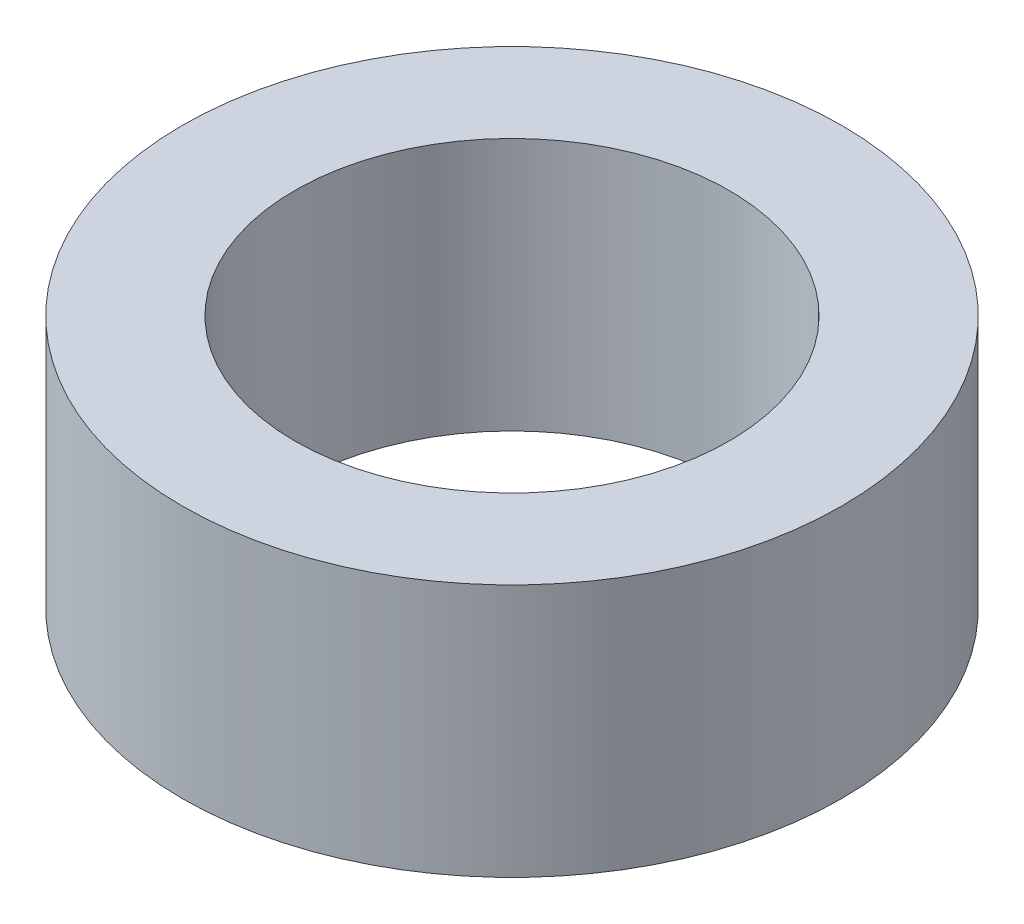
ISO-10303-21;
HEADER;
FILE_DESCRIPTION(('STEP AP214'),'2;1');
FILE_NAME('part.step','',(''),(''),'','','');
FILE_SCHEMA(('AUTOMOTIVE_DESIGN { 1 0 10303 214 1 1 1 1 }'));
ENDSEC;
DATA;
#1=APPLICATION_CONTEXT('core data for automotive mechanical design processes');
#2=APPLICATION_PROTOCOL_DEFINITION('international standard','automotive_design',2000,#1);
#3=PRODUCT_CONTEXT('',#1,'mechanical');
#4=PRODUCT('Part','Part','',(#3));
#5=PRODUCT_RELATED_PRODUCT_CATEGORY('part','',(#4));
#6=PRODUCT_DEFINITION_FORMATION('','',#4);
#7=PRODUCT_DEFINITION_CONTEXT('part definition',#1,'design');
#8=PRODUCT_DEFINITION('design','',#6,#7);
#9=PRODUCT_DEFINITION_SHAPE('','',#8);
#10=(LENGTH_UNIT() NAMED_UNIT(*) SI_UNIT(.MILLI.,.METRE.));
#11=(NAMED_UNIT(*) PLANE_ANGLE_UNIT() SI_UNIT($,.RADIAN.));
#12=(NAMED_UNIT(*) SI_UNIT($,.STERADIAN.) SOLID_ANGLE_UNIT());
#13=UNCERTAINTY_MEASURE_WITH_UNIT(LENGTH_MEASURE(1.E-05),#10,'distance_accuracy_value','');
#14=(GEOMETRIC_REPRESENTATION_CONTEXT(3) GLOBAL_UNCERTAINTY_ASSIGNED_CONTEXT((#13)) GLOBAL_UNIT_ASSIGNED_CONTEXT((#10,
#11,#12)) REPRESENTATION_CONTEXT('',''));
#15=CARTESIAN_POINT('',(0.,0.,0.));
#16=DIRECTION('',(0.,0.,1.));
#17=DIRECTION('',(1.,0.,0.));
#18=AXIS2_PLACEMENT_3D('',#15,#16,#17);
#19=CARTESIAN_POINT('',(0.,4.2875,0.));
#20=DIRECTION('',(0.,1.,0.));
#21=DIRECTION('',(0.,0.,1.));
#22=AXIS2_PLACEMENT_3D('',#19,#20,#21);
#23=PLANE('',#22);
#24=CARTESIAN_POINT('',(0.,4.2875,0.));
#25=DIRECTION('',(0.,1.,0.));
#26=DIRECTION('',(0.,0.,1.));
#27=AXIS2_PLACEMENT_3D('',#24,#25,#26);
#28=CIRCLE('',#27,5.58);
#29=CARTESIAN_POINT('',(0.,4.2875,5.58));
#30=VERTEX_POINT('',#29);
#31=EDGE_CURVE('E10',#30,#30,#28,.T.);
#32=ORIENTED_EDGE('',*,*,#31,.T.);
#33=EDGE_LOOP('',(#32));
#34=FACE_BOUND('',#33,.T.);
#35=CARTESIAN_POINT('',(0.,4.2875,0.));
#36=DIRECTION('',(0.,1.,0.));
#37=DIRECTION('',(0.,0.,1.));
#38=AXIS2_PLACEMENT_3D('',#35,#36,#37);
#39=CIRCLE('',#38,3.675);
#40=CARTESIAN_POINT('',(0.,4.2875,3.675));
#41=VERTEX_POINT('',#40);
#42=EDGE_CURVE('E50',#41,#41,#39,.T.);
#43=ORIENTED_EDGE('',*,*,#42,.F.);
#44=EDGE_LOOP('',(#43));
#45=FACE_BOUND('',#44,.T.);
#46=ADVANCED_FACE('F37',(#34,#45),#23,.T.);
#47=CARTESIAN_POINT('',(0.,0.,0.));
#48=DIRECTION('',(0.,1.,0.));
#49=DIRECTION('',(0.,0.,1.));
#50=AXIS2_PLACEMENT_3D('',#47,#48,#49);
#51=PLANE('',#50);
#52=CARTESIAN_POINT('',(0.,0.,0.));
#53=DIRECTION('',(0.,1.,0.));
#54=DIRECTION('',(0.,0.,1.));
#55=AXIS2_PLACEMENT_3D('',#52,#53,#54);
#56=CIRCLE('',#55,5.58);
#57=CARTESIAN_POINT('',(0.,0.,5.58));
#58=VERTEX_POINT('',#57);
#59=EDGE_CURVE('E41',#58,#58,#56,.T.);
#60=ORIENTED_EDGE('',*,*,#59,.F.);
#61=EDGE_LOOP('',(#60));
#62=FACE_BOUND('',#61,.T.);
#63=CARTESIAN_POINT('',(0.,0.,0.));
#64=DIRECTION('',(0.,1.,0.));
#65=DIRECTION('',(0.,0.,1.));
#66=AXIS2_PLACEMENT_3D('',#63,#64,#65);
#67=CIRCLE('',#66,3.675);
#68=CARTESIAN_POINT('',(0.,0.,3.675));
#69=VERTEX_POINT('',#68);
#70=EDGE_CURVE('E52',#69,#69,#67,.T.);
#71=ORIENTED_EDGE('',*,*,#70,.T.);
#72=EDGE_LOOP('',(#71));
#73=FACE_BOUND('',#72,.T.);
#74=ADVANCED_FACE('F64',(#62,#73),#51,.F.);
#75=CARTESIAN_POINT('',(0.,4.2875,0.));
#76=DIRECTION('',(0.,-1.,0.));
#77=DIRECTION('',(0.,0.,-1.));
#78=AXIS2_PLACEMENT_3D('',#75,#76,#77);
#79=CYLINDRICAL_SURFACE('',#78,5.58);
#80=ORIENTED_EDGE('',*,*,#31,.F.);
#81=EDGE_LOOP('',(#80));
#82=FACE_BOUND('',#81,.T.);
#83=ORIENTED_EDGE('',*,*,#59,.T.);
#84=EDGE_LOOP('',(#83));
#85=FACE_BOUND('',#84,.T.);
#86=ADVANCED_FACE('F39',(#82,#85),#79,.T.);
#87=CARTESIAN_POINT('',(0.,4.2875,0.));
#88=DIRECTION('',(0.,-1.,0.));
#89=DIRECTION('',(0.,0.,-1.));
#90=AXIS2_PLACEMENT_3D('',#87,#88,#89);
#91=CYLINDRICAL_SURFACE('',#90,3.675);
#92=ORIENTED_EDGE('',*,*,#42,.T.);
#93=EDGE_LOOP('',(#92));
#94=FACE_BOUND('',#93,.T.);
#95=ORIENTED_EDGE('',*,*,#70,.F.);
#96=EDGE_LOOP('',(#95));
#97=FACE_BOUND('',#96,.T.);
#98=ADVANCED_FACE('F60',(#94,#97),#91,.F.);
#99=CLOSED_SHELL('',(#46,#74,#86,#98));
#100=MANIFOLD_SOLID_BREP('B2',#99);
#101=ADVANCED_BREP_SHAPE_REPRESENTATION('',(#18,#100),#14);
#102=SHAPE_DEFINITION_REPRESENTATION(#9,#101);
ENDSEC;
END-ISO-10303-21;
